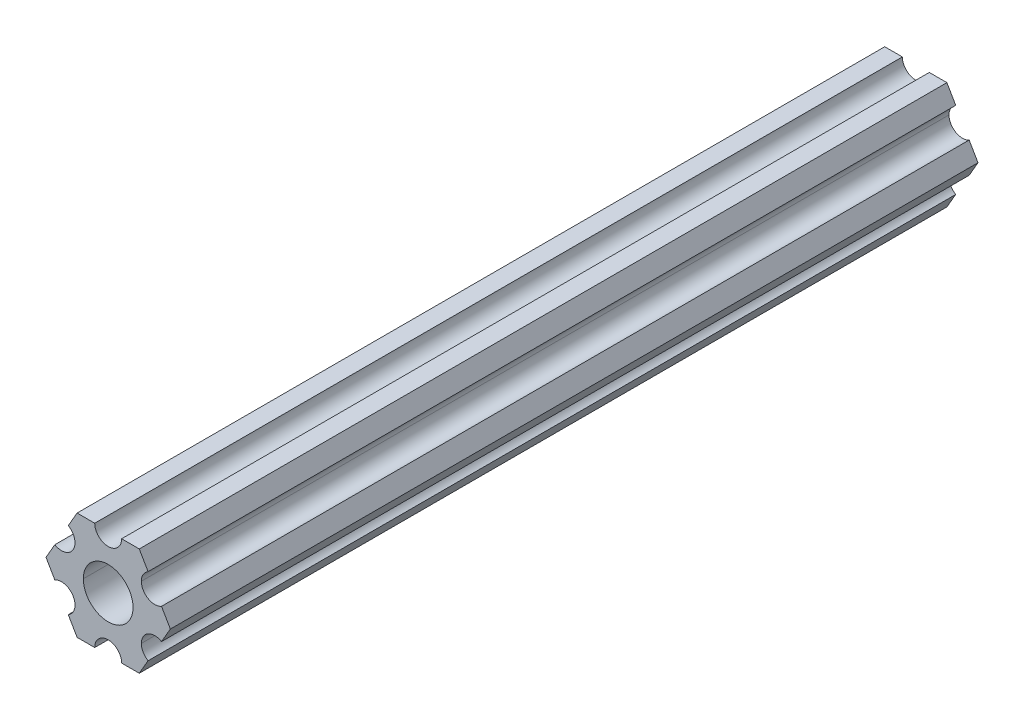
ISO-10303-21;
HEADER;
FILE_DESCRIPTION(('STEP AP214'),'2;1');
FILE_NAME('part.step','',(''),(''),'','','');
FILE_SCHEMA(('AUTOMOTIVE_DESIGN { 1 0 10303 214 1 1 1 1 }'));
ENDSEC;
DATA;
#1=APPLICATION_CONTEXT('core data for automotive mechanical design processes');
#2=APPLICATION_PROTOCOL_DEFINITION('international standard','automotive_design',2000,#1);
#3=PRODUCT_CONTEXT('',#1,'mechanical');
#4=PRODUCT('Part','Part','',(#3));
#5=PRODUCT_RELATED_PRODUCT_CATEGORY('part','',(#4));
#6=PRODUCT_DEFINITION_FORMATION('','',#4);
#7=PRODUCT_DEFINITION_CONTEXT('part definition',#1,'design');
#8=PRODUCT_DEFINITION('design','',#6,#7);
#9=PRODUCT_DEFINITION_SHAPE('','',#8);
#10=(LENGTH_UNIT() NAMED_UNIT(*) SI_UNIT(.MILLI.,.METRE.));
#11=(NAMED_UNIT(*) PLANE_ANGLE_UNIT() SI_UNIT($,.RADIAN.));
#12=(NAMED_UNIT(*) SI_UNIT($,.STERADIAN.) SOLID_ANGLE_UNIT());
#13=UNCERTAINTY_MEASURE_WITH_UNIT(LENGTH_MEASURE(1.E-05),#10,'distance_accuracy_value','');
#14=(GEOMETRIC_REPRESENTATION_CONTEXT(3) GLOBAL_UNCERTAINTY_ASSIGNED_CONTEXT((#13)) GLOBAL_UNIT_ASSIGNED_CONTEXT((#10,
#11,#12)) REPRESENTATION_CONTEXT('',''));
#15=CARTESIAN_POINT('',(0.,0.,0.));
#16=DIRECTION('',(0.,0.,1.));
#17=DIRECTION('',(1.,0.,0.));
#18=AXIS2_PLACEMENT_3D('',#15,#16,#17);
#19=CARTESIAN_POINT('',(0.,0.,304.8));
#20=DIRECTION('',(0.,0.,-1.));
#21=DIRECTION('',(-1.,0.,0.));
#22=AXIS2_PLACEMENT_3D('',#19,#20,#21);
#23=CYLINDRICAL_SURFACE('',#22,2.9337);
#24=CARTESIAN_POINT('',(0.,0.,95.25));
#25=DIRECTION('',(0.,0.,1.));
#26=DIRECTION('',(1.,0.,0.));
#27=AXIS2_PLACEMENT_3D('',#24,#25,#26);
#28=CIRCLE('',#27,2.9337);
#29=CARTESIAN_POINT('',(2.9337,0.,95.25));
#30=VERTEX_POINT('',#29);
#31=CARTESIAN_POINT('',(-2.9337,0.,95.25));
#32=VERTEX_POINT('',#31);
#33=EDGE_CURVE('E65',#30,#32,#28,.F.);
#34=ORIENTED_EDGE('',*,*,#33,.F.);
#35=DIRECTION('',(0.,0.,-1.));
#36=VECTOR('',#35,1.);
#37=CARTESIAN_POINT('',(2.9337,0.,304.8));
#38=LINE('',#37,#36);
#39=CARTESIAN_POINT('',(2.9337,0.,0.));
#40=VERTEX_POINT('',#39);
#41=EDGE_CURVE('E52',#30,#40,#38,.T.);
#42=ORIENTED_EDGE('',*,*,#41,.T.);
#43=CARTESIAN_POINT('',(0.,0.,0.));
#44=DIRECTION('',(0.,0.,1.));
#45=DIRECTION('',(1.,0.,0.));
#46=AXIS2_PLACEMENT_3D('',#43,#44,#45);
#47=CIRCLE('',#46,2.9337);
#48=CARTESIAN_POINT('',(-2.9337,0.,0.));
#49=VERTEX_POINT('',#48);
#50=EDGE_CURVE('E328',#49,#40,#47,.T.);
#51=ORIENTED_EDGE('',*,*,#50,.F.);
#52=DIRECTION('',(0.,0.,-1.));
#53=VECTOR('',#52,1.);
#54=CARTESIAN_POINT('',(-2.9337,0.,304.8));
#55=LINE('',#54,#53);
#56=EDGE_CURVE('E218',#32,#49,#55,.T.);
#57=ORIENTED_EDGE('',*,*,#56,.F.);
#58=EDGE_LOOP('',(#34,#42,#51,#57));
#59=FACE_BOUND('',#58,.T.);
#60=ADVANCED_FACE('F44',(#59),#23,.F.);
#61=CARTESIAN_POINT('',(5.49926150638082,-3.17499966684067,304.8));
#62=DIRECTION('',(0.,0.,-1.));
#63=DIRECTION('',(-1.,0.,0.));
#64=AXIS2_PLACEMENT_3D('',#61,#62,#63);
#65=CYLINDRICAL_SURFACE('',#64,1.5875);
#66=CARTESIAN_POINT('',(5.49926150638082,-3.17499966684067,95.25));
#67=DIRECTION('',(0.,0.,1.));
#68=DIRECTION('',(1.,0.,0.));
#69=AXIS2_PLACEMENT_3D('',#66,#67,#68);
#70=CIRCLE('',#69,1.5875);
#71=CARTESIAN_POINT('',(3.91176150638082,-3.17499966684067,95.25));
#72=VERTEX_POINT('',#71);
#73=CARTESIAN_POINT('',(6.29301142309098,-1.80018429024546,95.25));
#74=VERTEX_POINT('',#73);
#75=EDGE_CURVE('E439',#72,#74,#70,.F.);
#76=ORIENTED_EDGE('',*,*,#75,.F.);
#77=DIRECTION('',(0.,0.,-1.));
#78=VECTOR('',#77,1.);
#79=CARTESIAN_POINT('',(3.91176150638082,-3.17499966684067,304.8));
#80=LINE('',#79,#78);
#81=CARTESIAN_POINT('',(3.91176150638082,-3.17499966684067,0.));
#82=VERTEX_POINT('',#81);
#83=EDGE_CURVE('E225',#72,#82,#80,.T.);
#84=ORIENTED_EDGE('',*,*,#83,.T.);
#85=CARTESIAN_POINT('',(5.49926150638082,-3.17499966684067,0.));
#86=DIRECTION('',(0.,0.,-1.));
#87=DIRECTION('',(1.,0.,0.));
#88=AXIS2_PLACEMENT_3D('',#85,#86,#87);
#89=CIRCLE('',#88,1.5875);
#90=CARTESIAN_POINT('',(6.29301142309098,-1.80018429024546,0.));
#91=VERTEX_POINT('',#90);
#92=EDGE_CURVE('E227',#82,#91,#89,.T.);
#93=ORIENTED_EDGE('',*,*,#92,.T.);
#94=DIRECTION('',(0.,0.,-1.));
#95=VECTOR('',#94,1.);
#96=CARTESIAN_POINT('',(6.29301142309098,-1.80018429024546,304.8));
#97=LINE('',#96,#95);
#98=EDGE_CURVE('E249',#74,#91,#97,.T.);
#99=ORIENTED_EDGE('',*,*,#98,.F.);
#100=EDGE_LOOP('',(#76,#84,#93,#99));
#101=FACE_BOUND('',#100,.T.);
#102=ADVANCED_FACE('F498',(#101),#65,.F.);
#103=CARTESIAN_POINT('',(5.49926112168156,3.17500033315934,304.8));
#104=DIRECTION('',(0.,0.,-1.));
#105=DIRECTION('',(-1.,0.,0.));
#106=AXIS2_PLACEMENT_3D('',#103,#104,#105);
#107=CYLINDRICAL_SURFACE('',#106,1.5875);
#108=CARTESIAN_POINT('',(5.49926112168156,3.17500033315934,95.25));
#109=DIRECTION('',(0.,0.,1.));
#110=DIRECTION('',(1.,0.,0.));
#111=AXIS2_PLACEMENT_3D('',#108,#109,#110);
#112=CIRCLE('',#111,1.5875);
#113=CARTESIAN_POINT('',(3.91176112168156,3.17500033315934,95.25));
#114=VERTEX_POINT('',#113);
#115=CARTESIAN_POINT('',(4.70551103839172,4.54981561357972,95.25));
#116=VERTEX_POINT('',#115);
#117=EDGE_CURVE('E437',#114,#116,#112,.F.);
#118=ORIENTED_EDGE('',*,*,#117,.F.);
#119=DIRECTION('',(0.,0.,-1.));
#120=VECTOR('',#119,1.);
#121=CARTESIAN_POINT('',(3.91176112168156,3.17500033315934,304.8));
#122=LINE('',#121,#120);
#123=CARTESIAN_POINT('',(3.91176112168156,3.17500033315934,0.));
#124=VERTEX_POINT('',#123);
#125=EDGE_CURVE('E317',#114,#124,#122,.T.);
#126=ORIENTED_EDGE('',*,*,#125,.T.);
#127=CARTESIAN_POINT('',(5.49926112168156,3.17500033315934,0.));
#128=DIRECTION('',(0.,0.,-1.));
#129=DIRECTION('',(1.,0.,0.));
#130=AXIS2_PLACEMENT_3D('',#127,#128,#129);
#131=CIRCLE('',#130,1.5875);
#132=CARTESIAN_POINT('',(4.70551103839172,4.54981561357972,0.));
#133=VERTEX_POINT('',#132);
#134=EDGE_CURVE('E327',#124,#133,#131,.T.);
#135=ORIENTED_EDGE('',*,*,#134,.T.);
#136=DIRECTION('',(0.,0.,-1.));
#137=VECTOR('',#136,1.);
#138=CARTESIAN_POINT('',(4.70551103839172,4.54981561357972,304.8));
#139=LINE('',#138,#137);
#140=EDGE_CURVE('E305',#116,#133,#139,.T.);
#141=ORIENTED_EDGE('',*,*,#140,.F.);
#142=EDGE_LOOP('',(#118,#126,#135,#141));
#143=FACE_BOUND('',#142,.T.);
#144=ADVANCED_FACE('F467',(#143),#107,.F.);
#145=CARTESIAN_POINT('',(6.29301142309098,-1.80018429024546,304.8));
#146=DIRECTION('',(-0.866025434075723,0.499999947533953,0.));
#147=DIRECTION('',(0.,0.,1.));
#148=AXIS2_PLACEMENT_3D('',#145,#146,#147);
#149=PLANE('',#148);
#150=DIRECTION('',(0.499999947533953,0.866025434075723,0.));
#151=VECTOR('',#150,1.);
#152=CARTESIAN_POINT('',(6.29301142309098,-1.80018429024546,95.25));
#153=LINE('',#152,#151);
#154=CARTESIAN_POINT('',(7.33234841870827,4.44212519169686E-07,95.25));
#155=VERTEX_POINT('',#154);
#156=EDGE_CURVE('E313',#74,#155,#153,.T.);
#157=ORIENTED_EDGE('',*,*,#156,.F.);
#158=ORIENTED_EDGE('',*,*,#98,.T.);
#159=DIRECTION('',(0.499999947533953,0.866025434075723,0.));
#160=VECTOR('',#159,1.);
#161=CARTESIAN_POINT('',(6.29301142309098,-1.80018429024546,0.));
#162=LINE('',#161,#160);
#163=CARTESIAN_POINT('',(7.33234841870827,4.44212519169686E-07,0.));
#164=VERTEX_POINT('',#163);
#165=EDGE_CURVE('E251',#91,#164,#162,.T.);
#166=ORIENTED_EDGE('',*,*,#165,.T.);
#167=DIRECTION('',(0.,0.,-1.));
#168=VECTOR('',#167,1.);
#169=CARTESIAN_POINT('',(7.33234841870827,4.44212519169686E-07,304.8));
#170=LINE('',#169,#168);
#171=EDGE_CURVE('E287',#155,#164,#170,.T.);
#172=ORIENTED_EDGE('',*,*,#171,.F.);
#173=EDGE_LOOP('',(#157,#158,#166,#172));
#174=FACE_BOUND('',#173,.T.);
#175=ADVANCED_FACE('F456',(#174),#149,.F.);
#176=CARTESIAN_POINT('',(7.33234841870827,4.44212519169686E-07,304.8));
#177=DIRECTION('',(-0.866025373493145,-0.500000052466057,0.));
#178=DIRECTION('',(-0.500000052466057,0.866025373493145,0.));
#179=AXIS2_PLACEMENT_3D('',#176,#177,#178);
#180=PLANE('',#179);
#181=DIRECTION('',(-0.500000052466057,0.866025373493145,0.));
#182=VECTOR('',#181,1.);
#183=CARTESIAN_POINT('',(7.33234841870827,4.44212519169686E-07,95.25));
#184=LINE('',#183,#182);
#185=CARTESIAN_POINT('',(6.29301120497139,1.80018505273895,95.25));
#186=VERTEX_POINT('',#185);
#187=EDGE_CURVE('E443',#155,#186,#184,.T.);
#188=ORIENTED_EDGE('',*,*,#187,.F.);
#189=ORIENTED_EDGE('',*,*,#171,.T.);
#190=DIRECTION('',(-0.500000052466056,0.866025373493145,0.));
#191=VECTOR('',#190,1.);
#192=CARTESIAN_POINT('',(7.33234841870827,4.44212519169686E-07,0.));
#193=LINE('',#192,#191);
#194=CARTESIAN_POINT('',(6.29301120497139,1.80018505273894,0.));
#195=VERTEX_POINT('',#194);
#196=EDGE_CURVE('E252',#164,#195,#193,.T.);
#197=ORIENTED_EDGE('',*,*,#196,.T.);
#198=DIRECTION('',(0.,0.,-1.));
#199=VECTOR('',#198,1.);
#200=CARTESIAN_POINT('',(6.29301120497139,1.80018505273894,304.8));
#201=LINE('',#200,#199);
#202=EDGE_CURVE('E285',#186,#195,#201,.T.);
#203=ORIENTED_EDGE('',*,*,#202,.F.);
#204=EDGE_LOOP('',(#188,#189,#197,#203));
#205=FACE_BOUND('',#204,.T.);
#206=ADVANCED_FACE('F453',(#205),#180,.F.);
#207=CARTESIAN_POINT('',(5.49926112168156,3.17500033315934,304.8));
#208=DIRECTION('',(0.,0.,-1.));
#209=DIRECTION('',(-1.,0.,0.));
#210=AXIS2_PLACEMENT_3D('',#207,#208,#209);
#211=CYLINDRICAL_SURFACE('',#210,1.5875);
#212=CARTESIAN_POINT('',(5.49926112168156,3.17500033315934,95.25));
#213=DIRECTION('',(0.,0.,1.));
#214=DIRECTION('',(1.,0.,0.));
#215=AXIS2_PLACEMENT_3D('',#212,#213,#214);
#216=CIRCLE('',#215,1.5875);
#217=EDGE_CURVE('E441',#186,#114,#216,.F.);
#218=ORIENTED_EDGE('',*,*,#217,.F.);
#219=ORIENTED_EDGE('',*,*,#202,.T.);
#220=CARTESIAN_POINT('',(5.49926112168156,3.17500033315934,0.));
#221=DIRECTION('',(0.,0.,-1.));
#222=DIRECTION('',(1.,0.,0.));
#223=AXIS2_PLACEMENT_3D('',#220,#221,#222);
#224=CIRCLE('',#223,1.5875);
#225=EDGE_CURVE('E288',#195,#124,#224,.T.);
#226=ORIENTED_EDGE('',*,*,#225,.T.);
#227=ORIENTED_EDGE('',*,*,#125,.F.);
#228=EDGE_LOOP('',(#218,#219,#226,#227));
#229=FACE_BOUND('',#228,.T.);
#230=ADVANCED_FACE('F46',(#229),#211,.F.);
#231=CARTESIAN_POINT('',(4.70551103839172,4.54981561357972,304.8));
#232=DIRECTION('',(-0.866025373493151,-0.500000052466046,0.));
#233=DIRECTION('',(-0.500000052466046,0.866025373493151,0.));
#234=AXIS2_PLACEMENT_3D('',#231,#232,#233);
#235=PLANE('',#234);
#236=DIRECTION('',(-0.500000052466046,0.866025373493151,0.));
#237=VECTOR('',#236,1.);
#238=CARTESIAN_POINT('',(4.70551103839172,4.54981561357972,95.25));
#239=LINE('',#238,#237);
#240=CARTESIAN_POINT('',(3.66617382465481,6.35000022210627,95.25));
#241=VERTEX_POINT('',#240);
#242=EDGE_CURVE('E435',#116,#241,#239,.T.);
#243=ORIENTED_EDGE('',*,*,#242,.F.);
#244=ORIENTED_EDGE('',*,*,#140,.T.);
#245=DIRECTION('',(-0.500000052466046,0.866025373493151,0.));
#246=VECTOR('',#245,1.);
#247=CARTESIAN_POINT('',(4.70551103839172,4.54981561357972,0.));
#248=LINE('',#247,#246);
#249=CARTESIAN_POINT('',(3.66617382465481,6.35000022210627,0.));
#250=VERTEX_POINT('',#249);
#251=EDGE_CURVE('E318',#133,#250,#248,.T.);
#252=ORIENTED_EDGE('',*,*,#251,.T.);
#253=DIRECTION('',(0.,0.,-1.));
#254=VECTOR('',#253,1.);
#255=CARTESIAN_POINT('',(3.66617382465481,6.35000022210627,304.8));
#256=LINE('',#255,#254);
#257=EDGE_CURVE('E292',#241,#250,#256,.T.);
#258=ORIENTED_EDGE('',*,*,#257,.F.);
#259=EDGE_LOOP('',(#243,#244,#252,#258));
#260=FACE_BOUND('',#259,.T.);
#261=ADVANCED_FACE('F469',(#260),#235,.F.);
#262=CARTESIAN_POINT('',(3.66617382465481,6.35000022210627,304.8));
#263=DIRECTION('',(6.05825850611185E-08,-1.,0.));
#264=DIRECTION('',(0.,0.,-1.));
#265=AXIS2_PLACEMENT_3D('',#262,#263,#264);
#266=PLANE('',#265);
#267=DIRECTION('',(-0.999999999999998,-6.05825850611184E-08,0.));
#268=VECTOR('',#267,1.);
#269=CARTESIAN_POINT('',(3.66617382465481,6.35000022210627,95.25));
#270=LINE('',#269,#268);
#271=CARTESIAN_POINT('',(1.58749961530074,6.35,95.25));
#272=VERTEX_POINT('',#271);
#273=EDGE_CURVE('E433',#241,#272,#270,.T.);
#274=ORIENTED_EDGE('',*,*,#273,.F.);
#275=ORIENTED_EDGE('',*,*,#257,.T.);
#276=DIRECTION('',(-1.,-6.05825850611185E-08,0.));
#277=VECTOR('',#276,1.);
#278=CARTESIAN_POINT('',(3.66617382465481,6.35000022210627,0.));
#279=LINE('',#278,#277);
#280=CARTESIAN_POINT('',(1.58749961530074,6.35000009617482,0.));
#281=VERTEX_POINT('',#280);
#282=EDGE_CURVE('E231',#250,#281,#279,.T.);
#283=ORIENTED_EDGE('',*,*,#282,.T.);
#284=DIRECTION('',(0.,0.,-1.));
#285=VECTOR('',#284,1.);
#286=CARTESIAN_POINT('',(1.58749961530074,6.35000009617482,304.8));
#287=LINE('',#286,#285);
#288=EDGE_CURVE('E279',#272,#281,#287,.T.);
#289=ORIENTED_EDGE('',*,*,#288,.F.);
#290=EDGE_LOOP('',(#274,#275,#283,#289));
#291=FACE_BOUND('',#290,.T.);
#292=ADVANCED_FACE('F472',(#291),#266,.F.);
#293=CARTESIAN_POINT('',(-3.84699260060323E-07,6.35,304.8));
#294=DIRECTION('',(0.,0.,-1.));
#295=DIRECTION('',(-1.,0.,0.));
#296=AXIS2_PLACEMENT_3D('',#293,#294,#295);
#297=CYLINDRICAL_SURFACE('',#296,1.5875);
#298=CARTESIAN_POINT('',(-3.84699260060323E-07,6.35,95.25));
#299=DIRECTION('',(0.,0.,1.));
#300=DIRECTION('',(1.,0.,0.));
#301=AXIS2_PLACEMENT_3D('',#298,#299,#300);
#302=CIRCLE('',#301,1.5875);
#303=CARTESIAN_POINT('',(-1.58750038469926,6.34999990382518,95.25));
#304=VERTEX_POINT('',#303);
#305=EDGE_CURVE('E431',#272,#304,#302,.F.);
#306=ORIENTED_EDGE('',*,*,#305,.F.);
#307=ORIENTED_EDGE('',*,*,#288,.T.);
#308=CARTESIAN_POINT('',(-3.84699260060323E-07,6.35,0.));
#309=DIRECTION('',(0.,0.,-1.));
#310=DIRECTION('',(1.,0.,0.));
#311=AXIS2_PLACEMENT_3D('',#308,#309,#310);
#312=CIRCLE('',#311,1.5875);
#313=CARTESIAN_POINT('',(-1.58750038469926,6.34999990382519,0.));
#314=VERTEX_POINT('',#313);
#315=EDGE_CURVE('E289',#281,#314,#312,.T.);
#316=ORIENTED_EDGE('',*,*,#315,.T.);
#317=DIRECTION('',(0.,0.,-1.));
#318=VECTOR('',#317,1.);
#319=CARTESIAN_POINT('',(-1.58750038469926,6.34999990382519,304.8));
#320=LINE('',#319,#318);
#321=EDGE_CURVE('E280',#304,#314,#320,.T.);
#322=ORIENTED_EDGE('',*,*,#321,.F.);
#323=EDGE_LOOP('',(#306,#307,#316,#322));
#324=FACE_BOUND('',#323,.T.);
#325=ADVANCED_FACE('F473',(#324),#297,.F.);
#326=CARTESIAN_POINT('',(-1.58750038469926,6.34999990382518,304.8));
#327=DIRECTION('',(6.05825963273174E-08,-1.,0.));
#328=DIRECTION('',(0.,0.,-1.));
#329=AXIS2_PLACEMENT_3D('',#326,#327,#328);
#330=PLANE('',#329);
#331=DIRECTION('',(-0.999999999999998,-6.05825963273173E-08,0.));
#332=VECTOR('',#331,1.);
#333=CARTESIAN_POINT('',(-1.58750038469926,6.34999990382518,95.25));
#334=LINE('',#333,#332);
#335=CARTESIAN_POINT('',(-3.66617459405349,6.3499997778937,95.25));
#336=VERTEX_POINT('',#335);
#337=EDGE_CURVE('E429',#304,#336,#334,.T.);
#338=ORIENTED_EDGE('',*,*,#337,.F.);
#339=ORIENTED_EDGE('',*,*,#321,.T.);
#340=DIRECTION('',(-1.,-6.05825963273174E-08,0.));
#341=VECTOR('',#340,1.);
#342=CARTESIAN_POINT('',(-1.58750038469926,6.34999990382518,0.));
#343=LINE('',#342,#341);
#344=CARTESIAN_POINT('',(-3.66617459405349,6.3499997778937,0.));
#345=VERTEX_POINT('',#344);
#346=EDGE_CURVE('E275',#314,#345,#343,.T.);
#347=ORIENTED_EDGE('',*,*,#346,.T.);
#348=DIRECTION('',(0.,0.,-1.));
#349=VECTOR('',#348,1.);
#350=CARTESIAN_POINT('',(-3.66617459405349,6.3499997778937,304.8));
#351=LINE('',#350,#349);
#352=EDGE_CURVE('E257',#336,#345,#351,.T.);
#353=ORIENTED_EDGE('',*,*,#352,.F.);
#354=EDGE_LOOP('',(#338,#339,#347,#353));
#355=FACE_BOUND('',#354,.T.);
#356=ADVANCED_FACE('F479',(#355),#330,.F.);
#357=CARTESIAN_POINT('',(-3.66617459405349,6.3499997778937,304.8));
#358=DIRECTION('',(0.866025434075729,-0.499999947533942,0.));
#359=DIRECTION('',(0.,0.,-1.));
#360=AXIS2_PLACEMENT_3D('',#357,#358,#359);
#361=PLANE('',#360);
#362=DIRECTION('',(-0.499999947533942,-0.866025434075729,0.));
#363=VECTOR('',#362,1.);
#364=CARTESIAN_POINT('',(-3.66617459405349,6.3499997778937,95.25));
#365=LINE('',#364,#363);
#366=CARTESIAN_POINT('',(-4.70551158967065,4.54981504343587,95.25));
#367=VERTEX_POINT('',#366);
#368=EDGE_CURVE('E427',#336,#367,#365,.T.);
#369=ORIENTED_EDGE('',*,*,#368,.F.);
#370=ORIENTED_EDGE('',*,*,#352,.T.);
#371=DIRECTION('',(-0.499999947533943,-0.866025434075729,0.));
#372=VECTOR('',#371,1.);
#373=CARTESIAN_POINT('',(-3.66617459405349,6.3499997778937,0.));
#374=LINE('',#373,#372);
#375=CARTESIAN_POINT('',(-4.70551158967065,4.54981504343587,0.));
#376=VERTEX_POINT('',#375);
#377=EDGE_CURVE('E310',#345,#376,#374,.T.);
#378=ORIENTED_EDGE('',*,*,#377,.T.);
#379=DIRECTION('',(0.,0.,-1.));
#380=VECTOR('',#379,1.);
#381=CARTESIAN_POINT('',(-4.70551158967065,4.54981504343587,304.8));
#382=LINE('',#381,#380);
#383=EDGE_CURVE('E258',#367,#376,#382,.T.);
#384=ORIENTED_EDGE('',*,*,#383,.F.);
#385=EDGE_LOOP('',(#369,#370,#378,#384));
#386=FACE_BOUND('',#385,.T.);
#387=ADVANCED_FACE('F484',(#386),#361,.F.);
#388=CARTESIAN_POINT('',(-5.49926150638082,3.17499966684067,304.8));
#389=DIRECTION('',(0.,0.,-1.));
#390=DIRECTION('',(-1.,0.,0.));
#391=AXIS2_PLACEMENT_3D('',#388,#389,#390);
#392=CYLINDRICAL_SURFACE('',#391,1.5875);
#393=CARTESIAN_POINT('',(-5.49926150638082,3.17499966684067,95.25));
#394=DIRECTION('',(0.,0.,1.));
#395=DIRECTION('',(1.,0.,0.));
#396=AXIS2_PLACEMENT_3D('',#393,#394,#395);
#397=CIRCLE('',#396,1.5875);
#398=CARTESIAN_POINT('',(-6.29301142309098,1.80018429024547,95.25));
#399=VERTEX_POINT('',#398);
#400=EDGE_CURVE('E425',#367,#399,#397,.F.);
#401=ORIENTED_EDGE('',*,*,#400,.F.);
#402=ORIENTED_EDGE('',*,*,#383,.T.);
#403=CARTESIAN_POINT('',(-5.49926150638082,3.17499966684067,0.));
#404=DIRECTION('',(0.,0.,-1.));
#405=DIRECTION('',(1.,0.,0.));
#406=AXIS2_PLACEMENT_3D('',#403,#404,#405);
#407=CIRCLE('',#406,1.5875);
#408=CARTESIAN_POINT('',(-6.29301142309098,1.80018429024547,0.));
#409=VERTEX_POINT('',#408);
#410=EDGE_CURVE('E253',#376,#409,#407,.T.);
#411=ORIENTED_EDGE('',*,*,#410,.T.);
#412=DIRECTION('',(0.,0.,-1.));
#413=VECTOR('',#412,1.);
#414=CARTESIAN_POINT('',(-6.29301142309098,1.80018429024547,304.8));
#415=LINE('',#414,#413);
#416=EDGE_CURVE('E241',#399,#409,#415,.T.);
#417=ORIENTED_EDGE('',*,*,#416,.F.);
#418=EDGE_LOOP('',(#401,#402,#411,#417));
#419=FACE_BOUND('',#418,.T.);
#420=ADVANCED_FACE('F486',(#419),#392,.F.);
#421=CARTESIAN_POINT('',(-6.29301142309098,1.80018429024547,304.8));
#422=DIRECTION('',(0.866025434075724,-0.499999947533952,0.));
#423=DIRECTION('',(0.,0.,-1.));
#424=AXIS2_PLACEMENT_3D('',#421,#422,#423);
#425=PLANE('',#424);
#426=DIRECTION('',(-0.499999947533952,-0.866025434075724,0.));
#427=VECTOR('',#426,1.);
#428=CARTESIAN_POINT('',(-6.29301142309098,1.80018429024547,95.25));
#429=LINE('',#428,#427);
#430=CARTESIAN_POINT('',(-7.33234841870827,-4.44212523790841E-07,95.25));
#431=VERTEX_POINT('',#430);
#432=EDGE_CURVE('E372',#399,#431,#429,.T.);
#433=ORIENTED_EDGE('',*,*,#432,.F.);
#434=ORIENTED_EDGE('',*,*,#416,.T.);
#435=DIRECTION('',(-0.499999947533951,-0.866025434075724,0.));
#436=VECTOR('',#435,1.);
#437=CARTESIAN_POINT('',(-6.29301142309098,1.80018429024547,0.));
#438=LINE('',#437,#436);
#439=CARTESIAN_POINT('',(-7.33234841870827,-4.44212523790841E-07,0.));
#440=VERTEX_POINT('',#439);
#441=EDGE_CURVE('E243',#409,#440,#438,.T.);
#442=ORIENTED_EDGE('',*,*,#441,.T.);
#443=DIRECTION('',(0.,0.,-1.));
#444=VECTOR('',#443,1.);
#445=CARTESIAN_POINT('',(-7.33234841870827,-4.44212523790841E-07,304.8));
#446=LINE('',#445,#444);
#447=EDGE_CURVE('E284',#431,#440,#446,.T.);
#448=ORIENTED_EDGE('',*,*,#447,.F.);
#449=EDGE_LOOP('',(#433,#434,#442,#448));
#450=FACE_BOUND('',#449,.T.);
#451=ADVANCED_FACE('F371',(#450),#425,.F.);
#452=CARTESIAN_POINT('',(-7.33234841870827,-4.44212523790841E-07,304.8));
#453=DIRECTION('',(0.866025373493151,0.500000052466045,0.));
#454=DIRECTION('',(0.,0.,-1.));
#455=AXIS2_PLACEMENT_3D('',#452,#453,#454);
#456=PLANE('',#455);
#457=DIRECTION('',(0.500000052466045,-0.866025373493151,0.));
#458=VECTOR('',#457,1.);
#459=CARTESIAN_POINT('',(-7.33234841870827,-4.44212523790841E-07,95.25));
#460=LINE('',#459,#458);
#461=CARTESIAN_POINT('',(-6.29301120497141,-1.80018505273896,95.25));
#462=VERTEX_POINT('',#461);
#463=EDGE_CURVE('E368',#431,#462,#460,.T.);
#464=ORIENTED_EDGE('',*,*,#463,.F.);
#465=ORIENTED_EDGE('',*,*,#447,.T.);
#466=DIRECTION('',(0.500000052466045,-0.866025373493151,0.));
#467=VECTOR('',#466,1.);
#468=CARTESIAN_POINT('',(-7.33234841870827,-4.44212523790841E-07,0.));
#469=LINE('',#468,#467);
#470=CARTESIAN_POINT('',(-6.29301120497141,-1.80018505273897,0.));
#471=VERTEX_POINT('',#470);
#472=EDGE_CURVE('E244',#440,#471,#469,.T.);
#473=ORIENTED_EDGE('',*,*,#472,.T.);
#474=DIRECTION('',(0.,0.,-1.));
#475=VECTOR('',#474,1.);
#476=CARTESIAN_POINT('',(-6.29301120497141,-1.80018505273897,304.8));
#477=LINE('',#476,#475);
#478=EDGE_CURVE('E264',#462,#471,#477,.T.);
#479=ORIENTED_EDGE('',*,*,#478,.F.);
#480=EDGE_LOOP('',(#464,#465,#473,#479));
#481=FACE_BOUND('',#480,.T.);
#482=ADVANCED_FACE('F366',(#481),#456,.F.);
#483=CARTESIAN_POINT('',(-5.49926112168156,-3.17500033315934,304.8));
#484=DIRECTION('',(0.,0.,-1.));
#485=DIRECTION('',(-1.,0.,0.));
#486=AXIS2_PLACEMENT_3D('',#483,#484,#485);
#487=CYLINDRICAL_SURFACE('',#486,1.5875);
#488=CARTESIAN_POINT('',(-5.49926112168156,-3.17500033315934,95.25));
#489=DIRECTION('',(0.,0.,1.));
#490=DIRECTION('',(1.,0.,0.));
#491=AXIS2_PLACEMENT_3D('',#488,#489,#490);
#492=CIRCLE('',#491,1.5875);
#493=CARTESIAN_POINT('',(-4.70551103839172,-4.54981561357972,95.25));
#494=VERTEX_POINT('',#493);
#495=EDGE_CURVE('E417',#462,#494,#492,.F.);
#496=ORIENTED_EDGE('',*,*,#495,.F.);
#497=ORIENTED_EDGE('',*,*,#478,.T.);
#498=CARTESIAN_POINT('',(-5.49926112168156,-3.17500033315934,0.));
#499=DIRECTION('',(0.,0.,-1.));
#500=DIRECTION('',(1.,0.,0.));
#501=AXIS2_PLACEMENT_3D('',#498,#499,#500);
#502=CIRCLE('',#501,1.5875);
#503=CARTESIAN_POINT('',(-4.70551103839172,-4.54981561357972,0.));
#504=VERTEX_POINT('',#503);
#505=EDGE_CURVE('E339',#471,#504,#502,.T.);
#506=ORIENTED_EDGE('',*,*,#505,.T.);
#507=DIRECTION('',(0.,0.,-1.));
#508=VECTOR('',#507,1.);
#509=CARTESIAN_POINT('',(-4.70551103839172,-4.54981561357972,304.8));
#510=LINE('',#509,#508);
#511=EDGE_CURVE('E265',#494,#504,#510,.T.);
#512=ORIENTED_EDGE('',*,*,#511,.F.);
#513=EDGE_LOOP('',(#496,#497,#506,#512));
#514=FACE_BOUND('',#513,.T.);
#515=ADVANCED_FACE('F353',(#514),#487,.F.);
#516=CARTESIAN_POINT('',(-4.70551103839172,-4.54981561357972,304.8));
#517=DIRECTION('',(0.866025373493152,0.500000052466045,0.));
#518=DIRECTION('',(0.,0.,-1.));
#519=AXIS2_PLACEMENT_3D('',#516,#517,#518);
#520=PLANE('',#519);
#521=DIRECTION('',(0.500000052466045,-0.866025373493152,0.));
#522=VECTOR('',#521,1.);
#523=CARTESIAN_POINT('',(-4.70551103839172,-4.54981561357972,95.25));
#524=LINE('',#523,#522);
#525=CARTESIAN_POINT('',(-3.66617382465481,-6.35000022210628,95.25));
#526=VERTEX_POINT('',#525);
#527=EDGE_CURVE('E416',#494,#526,#524,.T.);
#528=ORIENTED_EDGE('',*,*,#527,.F.);
#529=ORIENTED_EDGE('',*,*,#511,.T.);
#530=DIRECTION('',(0.500000052466045,-0.866025373493152,0.));
#531=VECTOR('',#530,1.);
#532=CARTESIAN_POINT('',(-4.70551103839172,-4.54981561357972,0.));
#533=LINE('',#532,#531);
#534=CARTESIAN_POINT('',(-3.66617382465481,-6.35000022210628,0.));
#535=VERTEX_POINT('',#534);
#536=EDGE_CURVE('E260',#504,#535,#533,.T.);
#537=ORIENTED_EDGE('',*,*,#536,.T.);
#538=DIRECTION('',(0.,0.,-1.));
#539=VECTOR('',#538,1.);
#540=CARTESIAN_POINT('',(-3.66617382465481,-6.35000022210628,304.8));
#541=LINE('',#540,#539);
#542=EDGE_CURVE('E271',#526,#535,#541,.T.);
#543=ORIENTED_EDGE('',*,*,#542,.F.);
#544=EDGE_LOOP('',(#528,#529,#537,#543));
#545=FACE_BOUND('',#544,.T.);
#546=ADVANCED_FACE('F415',(#545),#520,.F.);
#547=CARTESIAN_POINT('',(-3.66617382465481,-6.35000022210628,304.8));
#548=DIRECTION('',(-6.05825854783851E-08,1.,0.));
#549=DIRECTION('',(0.,0.,1.));
#550=AXIS2_PLACEMENT_3D('',#547,#548,#549);
#551=PLANE('',#550);
#552=DIRECTION('',(0.999999999999998,6.0582585478385E-08,0.));
#553=VECTOR('',#552,1.);
#554=CARTESIAN_POINT('',(-3.66617382465481,-6.35000022210628,95.25));
#555=LINE('',#554,#553);
#556=CARTESIAN_POINT('',(-1.58749961530073,-6.35000009617482,95.25));
#557=VERTEX_POINT('',#556);
#558=EDGE_CURVE('E412',#526,#557,#555,.T.);
#559=ORIENTED_EDGE('',*,*,#558,.F.);
#560=ORIENTED_EDGE('',*,*,#542,.T.);
#561=DIRECTION('',(1.,6.05825854783851E-08,0.));
#562=VECTOR('',#561,1.);
#563=CARTESIAN_POINT('',(-3.66617382465481,-6.35000022210628,0.));
#564=LINE('',#563,#562);
#565=CARTESIAN_POINT('',(-1.58749961530073,-6.35000009617482,0.));
#566=VERTEX_POINT('',#565);
#567=EDGE_CURVE('E267',#535,#566,#564,.T.);
#568=ORIENTED_EDGE('',*,*,#567,.T.);
#569=DIRECTION('',(0.,0.,-1.));
#570=VECTOR('',#569,1.);
#571=CARTESIAN_POINT('',(-1.58749961530073,-6.35000009617482,304.8));
#572=LINE('',#571,#570);
#573=EDGE_CURVE('E233',#557,#566,#572,.T.);
#574=ORIENTED_EDGE('',*,*,#573,.F.);
#575=EDGE_LOOP('',(#559,#560,#568,#574));
#576=FACE_BOUND('',#575,.T.);
#577=ADVANCED_FACE('F410',(#576),#551,.F.);
#578=CARTESIAN_POINT('',(3.8469926204343E-07,-6.35,304.8));
#579=DIRECTION('',(0.,0.,-1.));
#580=DIRECTION('',(-1.,0.,0.));
#581=AXIS2_PLACEMENT_3D('',#578,#579,#580);
#582=CYLINDRICAL_SURFACE('',#581,1.5875);
#583=CARTESIAN_POINT('',(3.8469926204343E-07,-6.35,95.25));
#584=DIRECTION('',(0.,0.,1.));
#585=DIRECTION('',(1.,0.,0.));
#586=AXIS2_PLACEMENT_3D('',#583,#584,#585);
#587=CIRCLE('',#586,1.5875);
#588=CARTESIAN_POINT('',(1.58750038469926,-6.34999990382518,95.25));
#589=VERTEX_POINT('',#588);
#590=EDGE_CURVE('E406',#557,#589,#587,.F.);
#591=ORIENTED_EDGE('',*,*,#590,.F.);
#592=ORIENTED_EDGE('',*,*,#573,.T.);
#593=CARTESIAN_POINT('',(3.8469926204343E-07,-6.35,0.));
#594=DIRECTION('',(0.,0.,-1.));
#595=DIRECTION('',(1.,0.,0.));
#596=AXIS2_PLACEMENT_3D('',#593,#594,#595);
#597=CIRCLE('',#596,1.5875);
#598=CARTESIAN_POINT('',(1.58750038469926,-6.34999990382518,0.));
#599=VERTEX_POINT('',#598);
#600=EDGE_CURVE('E235',#566,#599,#597,.T.);
#601=ORIENTED_EDGE('',*,*,#600,.T.);
#602=DIRECTION('',(0.,0.,-1.));
#603=VECTOR('',#602,1.);
#604=CARTESIAN_POINT('',(1.58750038469926,-6.34999990382518,304.8));
#605=LINE('',#604,#603);
#606=EDGE_CURVE('E240',#589,#599,#605,.T.);
#607=ORIENTED_EDGE('',*,*,#606,.F.);
#608=EDGE_LOOP('',(#591,#592,#601,#607));
#609=FACE_BOUND('',#608,.T.);
#610=ADVANCED_FACE('F405',(#609),#582,.F.);
#611=CARTESIAN_POINT('',(1.58750038469926,-6.34999990382518,304.8));
#612=DIRECTION('',(-6.05825721258438E-08,1.,0.));
#613=DIRECTION('',(0.,0.,1.));
#614=AXIS2_PLACEMENT_3D('',#611,#612,#613);
#615=PLANE('',#614);
#616=DIRECTION('',(0.999999999999998,6.05825721258437E-08,0.));
#617=VECTOR('',#616,1.);
#618=CARTESIAN_POINT('',(1.58750038469926,-6.34999990382518,95.25));
#619=LINE('',#618,#617);
#620=CARTESIAN_POINT('',(3.66617459405346,-6.34999977789375,95.25));
#621=VERTEX_POINT('',#620);
#622=EDGE_CURVE('E402',#589,#621,#619,.T.);
#623=ORIENTED_EDGE('',*,*,#622,.F.);
#624=ORIENTED_EDGE('',*,*,#606,.T.);
#625=DIRECTION('',(1.,6.05825721258438E-08,0.));
#626=VECTOR('',#625,1.);
#627=CARTESIAN_POINT('',(1.58750038469926,-6.34999990382518,0.));
#628=LINE('',#627,#626);
#629=CARTESIAN_POINT('',(3.66617459405346,-6.34999977789375,0.));
#630=VERTEX_POINT('',#629);
#631=EDGE_CURVE('E236',#599,#630,#628,.T.);
#632=ORIENTED_EDGE('',*,*,#631,.T.);
#633=DIRECTION('',(0.,0.,-1.));
#634=VECTOR('',#633,1.);
#635=CARTESIAN_POINT('',(3.66617459405346,-6.34999977789375,304.8));
#636=LINE('',#635,#634);
#637=EDGE_CURVE('E245',#621,#630,#636,.T.);
#638=ORIENTED_EDGE('',*,*,#637,.F.);
#639=EDGE_LOOP('',(#623,#624,#632,#638));
#640=FACE_BOUND('',#639,.T.);
#641=ADVANCED_FACE('F400',(#640),#615,.F.);
#642=CARTESIAN_POINT('',(3.66617459405346,-6.34999977789375,304.8));
#643=DIRECTION('',(-0.86602543407573,0.499999947533941,0.));
#644=DIRECTION('',(0.,0.,1.));
#645=AXIS2_PLACEMENT_3D('',#642,#643,#644);
#646=PLANE('',#645);
#647=DIRECTION('',(0.499999947533941,0.86602543407573,0.));
#648=VECTOR('',#647,1.);
#649=CARTESIAN_POINT('',(3.66617459405346,-6.34999977789375,95.25));
#650=LINE('',#649,#648);
#651=CARTESIAN_POINT('',(4.70551158967065,-4.54981504343587,95.25));
#652=VERTEX_POINT('',#651);
#653=EDGE_CURVE('E59',#621,#652,#650,.T.);
#654=ORIENTED_EDGE('',*,*,#653,.F.);
#655=ORIENTED_EDGE('',*,*,#637,.T.);
#656=DIRECTION('',(0.499999947533941,0.86602543407573,0.));
#657=VECTOR('',#656,1.);
#658=CARTESIAN_POINT('',(3.66617459405346,-6.34999977789375,0.));
#659=LINE('',#658,#657);
#660=CARTESIAN_POINT('',(4.70551158967065,-4.54981504343587,0.));
#661=VERTEX_POINT('',#660);
#662=EDGE_CURVE('E247',#630,#661,#659,.T.);
#663=ORIENTED_EDGE('',*,*,#662,.T.);
#664=DIRECTION('',(0.,0.,-1.));
#665=VECTOR('',#664,1.);
#666=CARTESIAN_POINT('',(4.70551158967065,-4.54981504343587,304.8));
#667=LINE('',#666,#665);
#668=EDGE_CURVE('E248',#652,#661,#667,.T.);
#669=ORIENTED_EDGE('',*,*,#668,.F.);
#670=EDGE_LOOP('',(#654,#655,#663,#669));
#671=FACE_BOUND('',#670,.T.);
#672=ADVANCED_FACE('F392',(#671),#646,.F.);
#673=CARTESIAN_POINT('',(5.49926150638082,-3.17499966684067,304.8));
#674=DIRECTION('',(0.,0.,-1.));
#675=DIRECTION('',(-1.,0.,0.));
#676=AXIS2_PLACEMENT_3D('',#673,#674,#675);
#677=CYLINDRICAL_SURFACE('',#676,1.5875);
#678=CARTESIAN_POINT('',(5.49926150638082,-3.17499966684067,95.25));
#679=DIRECTION('',(0.,0.,1.));
#680=DIRECTION('',(1.,0.,0.));
#681=AXIS2_PLACEMENT_3D('',#678,#679,#680);
#682=CIRCLE('',#681,1.5875);
#683=EDGE_CURVE('E219',#652,#72,#682,.F.);
#684=ORIENTED_EDGE('',*,*,#683,.F.);
#685=ORIENTED_EDGE('',*,*,#668,.T.);
#686=CARTESIAN_POINT('',(5.49926150638082,-3.17499966684067,0.));
#687=DIRECTION('',(0.,0.,-1.));
#688=DIRECTION('',(1.,0.,0.));
#689=AXIS2_PLACEMENT_3D('',#686,#687,#688);
#690=CIRCLE('',#689,1.5875);
#691=EDGE_CURVE('E312',#661,#82,#690,.T.);
#692=ORIENTED_EDGE('',*,*,#691,.T.);
#693=ORIENTED_EDGE('',*,*,#83,.F.);
#694=EDGE_LOOP('',(#684,#685,#692,#693));
#695=FACE_BOUND('',#694,.T.);
#696=ADVANCED_FACE('F522',(#695),#677,.F.);
#697=CARTESIAN_POINT('',(0.,0.,304.8));
#698=DIRECTION('',(0.,0.,-1.));
#699=DIRECTION('',(-1.,0.,0.));
#700=AXIS2_PLACEMENT_3D('',#697,#698,#699);
#701=CYLINDRICAL_SURFACE('',#700,2.9337);
#702=CARTESIAN_POINT('',(0.,0.,95.25));
#703=DIRECTION('',(0.,0.,1.));
#704=DIRECTION('',(1.,0.,0.));
#705=AXIS2_PLACEMENT_3D('',#702,#703,#704);
#706=CIRCLE('',#705,2.9337);
#707=EDGE_CURVE('E11',#32,#30,#706,.F.);
#708=ORIENTED_EDGE('',*,*,#707,.F.);
#709=ORIENTED_EDGE('',*,*,#56,.T.);
#710=CARTESIAN_POINT('',(0.,0.,0.));
#711=DIRECTION('',(0.,0.,1.));
#712=DIRECTION('',(1.,0.,0.));
#713=AXIS2_PLACEMENT_3D('',#710,#711,#712);
#714=CIRCLE('',#713,2.9337);
#715=EDGE_CURVE('E224',#40,#49,#714,.T.);
#716=ORIENTED_EDGE('',*,*,#715,.F.);
#717=ORIENTED_EDGE('',*,*,#41,.F.);
#718=EDGE_LOOP('',(#708,#709,#716,#717));
#719=FACE_BOUND('',#718,.T.);
#720=ADVANCED_FACE('F222',(#719),#701,.F.);
#721=CARTESIAN_POINT('',(5.49926112168156,3.17500033315934,0.));
#722=DIRECTION('',(0.,0.,1.));
#723=DIRECTION('',(1.,0.,0.));
#724=AXIS2_PLACEMENT_3D('',#721,#722,#723);
#725=PLANE('',#724);
#726=ORIENTED_EDGE('',*,*,#165,.F.);
#727=ORIENTED_EDGE('',*,*,#92,.F.);
#728=ORIENTED_EDGE('',*,*,#691,.F.);
#729=ORIENTED_EDGE('',*,*,#662,.F.);
#730=ORIENTED_EDGE('',*,*,#631,.F.);
#731=ORIENTED_EDGE('',*,*,#600,.F.);
#732=ORIENTED_EDGE('',*,*,#567,.F.);
#733=ORIENTED_EDGE('',*,*,#536,.F.);
#734=ORIENTED_EDGE('',*,*,#505,.F.);
#735=ORIENTED_EDGE('',*,*,#472,.F.);
#736=ORIENTED_EDGE('',*,*,#441,.F.);
#737=ORIENTED_EDGE('',*,*,#410,.F.);
#738=ORIENTED_EDGE('',*,*,#377,.F.);
#739=ORIENTED_EDGE('',*,*,#346,.F.);
#740=ORIENTED_EDGE('',*,*,#315,.F.);
#741=ORIENTED_EDGE('',*,*,#282,.F.);
#742=ORIENTED_EDGE('',*,*,#251,.F.);
#743=ORIENTED_EDGE('',*,*,#134,.F.);
#744=ORIENTED_EDGE('',*,*,#225,.F.);
#745=ORIENTED_EDGE('',*,*,#196,.F.);
#746=EDGE_LOOP('',(#726,#727,#728,#729,#730,#731,#732,#733,#734,#735,#736,#737,#738,#739,#740,
#741,#742,#743,#744,#745));
#747=FACE_BOUND('',#746,.T.);
#748=ORIENTED_EDGE('',*,*,#50,.T.);
#749=ORIENTED_EDGE('',*,*,#715,.T.);
#750=EDGE_LOOP('',(#748,#749));
#751=FACE_BOUND('',#750,.T.);
#752=ADVANCED_FACE('F359',(#747,#751),#725,.F.);
#753=CARTESIAN_POINT('',(0.,0.,95.25));
#754=DIRECTION('',(0.,0.,1.));
#755=DIRECTION('',(1.,0.,0.));
#756=AXIS2_PLACEMENT_3D('',#753,#754,#755);
#757=PLANE('',#756);
#758=ORIENTED_EDGE('',*,*,#33,.T.);
#759=ORIENTED_EDGE('',*,*,#707,.T.);
#760=EDGE_LOOP('',(#758,#759));
#761=FACE_BOUND('',#760,.T.);
#762=ORIENTED_EDGE('',*,*,#156,.T.);
#763=ORIENTED_EDGE('',*,*,#187,.T.);
#764=ORIENTED_EDGE('',*,*,#217,.T.);
#765=ORIENTED_EDGE('',*,*,#117,.T.);
#766=ORIENTED_EDGE('',*,*,#242,.T.);
#767=ORIENTED_EDGE('',*,*,#273,.T.);
#768=ORIENTED_EDGE('',*,*,#305,.T.);
#769=ORIENTED_EDGE('',*,*,#337,.T.);
#770=ORIENTED_EDGE('',*,*,#368,.T.);
#771=ORIENTED_EDGE('',*,*,#400,.T.);
#772=ORIENTED_EDGE('',*,*,#432,.T.);
#773=ORIENTED_EDGE('',*,*,#463,.T.);
#774=ORIENTED_EDGE('',*,*,#495,.T.);
#775=ORIENTED_EDGE('',*,*,#527,.T.);
#776=ORIENTED_EDGE('',*,*,#558,.T.);
#777=ORIENTED_EDGE('',*,*,#590,.T.);
#778=ORIENTED_EDGE('',*,*,#622,.T.);
#779=ORIENTED_EDGE('',*,*,#653,.T.);
#780=ORIENTED_EDGE('',*,*,#683,.T.);
#781=ORIENTED_EDGE('',*,*,#75,.T.);
#782=EDGE_LOOP('',(#762,#763,#764,#765,#766,#767,#768,#769,#770,#771,#772,#773,#774,#775,#776,
#777,#778,#779,#780,#781));
#783=FACE_BOUND('',#782,.T.);
#784=ADVANCED_FACE('F211',(#761,#783),#757,.T.);
#785=CLOSED_SHELL('',(#60,#102,#144,#175,#206,#230,#261,#292,#325,#356,#387,#420,#451,#482,#515,
#546,#577,#610,#641,#672,#696,#720,#752,#784));
#786=MANIFOLD_SOLID_BREP('B2',#785);
#787=ADVANCED_BREP_SHAPE_REPRESENTATION('',(#18,#786),#14);
#788=SHAPE_DEFINITION_REPRESENTATION(#9,#787);
ENDSEC;
END-ISO-10303-21;
